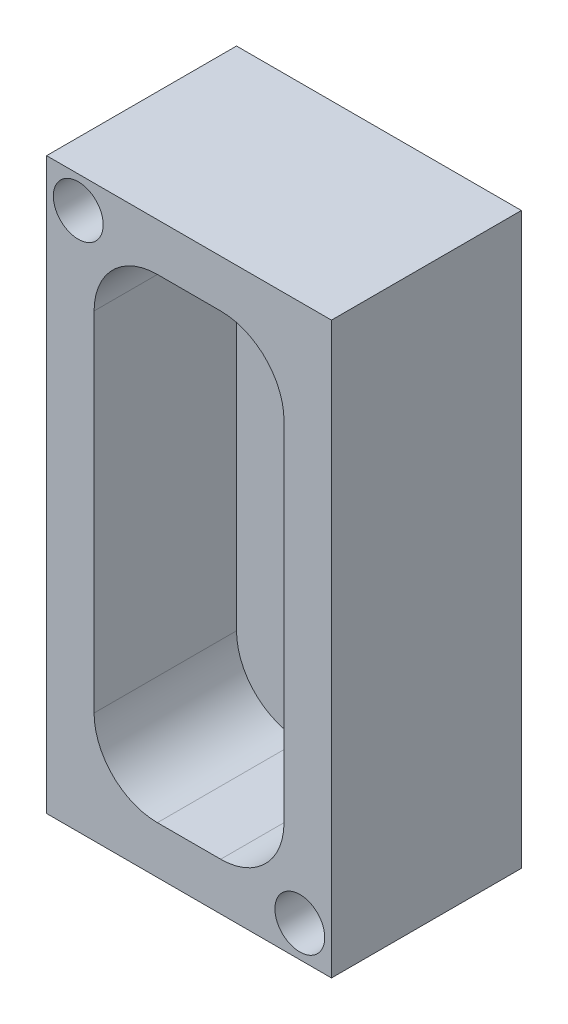
ISO-10303-21;
HEADER;
FILE_DESCRIPTION(('STEP AP214'),'2;1');
FILE_NAME('part.step','',(''),(''),'','','');
FILE_SCHEMA(('AUTOMOTIVE_DESIGN { 1 0 10303 214 1 1 1 1 }'));
ENDSEC;
DATA;
#1=APPLICATION_CONTEXT('core data for automotive mechanical design processes');
#2=APPLICATION_PROTOCOL_DEFINITION('international standard','automotive_design',2000,#1);
#3=PRODUCT_CONTEXT('',#1,'mechanical');
#4=PRODUCT('Part','Part','',(#3));
#5=PRODUCT_RELATED_PRODUCT_CATEGORY('part','',(#4));
#6=PRODUCT_DEFINITION_FORMATION('','',#4);
#7=PRODUCT_DEFINITION_CONTEXT('part definition',#1,'design');
#8=PRODUCT_DEFINITION('design','',#6,#7);
#9=PRODUCT_DEFINITION_SHAPE('','',#8);
#10=(LENGTH_UNIT() NAMED_UNIT(*) SI_UNIT(.MILLI.,.METRE.));
#11=(NAMED_UNIT(*) PLANE_ANGLE_UNIT() SI_UNIT($,.RADIAN.));
#12=(NAMED_UNIT(*) SI_UNIT($,.STERADIAN.) SOLID_ANGLE_UNIT());
#13=UNCERTAINTY_MEASURE_WITH_UNIT(LENGTH_MEASURE(1.E-05),#10,'distance_accuracy_value','');
#14=(GEOMETRIC_REPRESENTATION_CONTEXT(3) GLOBAL_UNCERTAINTY_ASSIGNED_CONTEXT((#13)) GLOBAL_UNIT_ASSIGNED_CONTEXT((#10,
#11,#12)) REPRESENTATION_CONTEXT('',''));
#15=CARTESIAN_POINT('',(0.,0.,0.));
#16=DIRECTION('',(0.,0.,1.));
#17=DIRECTION('',(1.,0.,0.));
#18=AXIS2_PLACEMENT_3D('',#15,#16,#17);
#19=CARTESIAN_POINT('',(0.,-12.,10.));
#20=DIRECTION('',(0.,0.,-1.));
#21=DIRECTION('',(-1.,0.,0.));
#22=AXIS2_PLACEMENT_3D('',#19,#20,#21);
#23=CYLINDRICAL_SURFACE('',#22,2.525);
#24=CARTESIAN_POINT('',(0.,-12.,0.));
#25=DIRECTION('',(0.,0.,1.));
#26=DIRECTION('',(1.,0.,0.));
#27=AXIS2_PLACEMENT_3D('',#24,#25,#26);
#28=CIRCLE('',#27,2.525);
#29=CARTESIAN_POINT('',(2.525,-12.,0.));
#30=VERTEX_POINT('',#29);
#31=EDGE_CURVE('E196',#30,#30,#28,.T.);
#32=ORIENTED_EDGE('',*,*,#31,.F.);
#33=EDGE_LOOP('',(#32));
#34=FACE_BOUND('',#33,.T.);
#35=CARTESIAN_POINT('',(0.,-12.,2.));
#36=DIRECTION('',(0.,0.,1.));
#37=DIRECTION('',(1.,0.,0.));
#38=AXIS2_PLACEMENT_3D('',#35,#36,#37);
#39=CIRCLE('',#38,2.525);
#40=CARTESIAN_POINT('',(2.525,-12.,2.));
#41=VERTEX_POINT('',#40);
#42=EDGE_CURVE('E200',#41,#41,#39,.T.);
#43=ORIENTED_EDGE('',*,*,#42,.T.);
#44=EDGE_LOOP('',(#43));
#45=FACE_BOUND('',#44,.T.);
#46=ADVANCED_FACE('F43',(#34,#45),#23,.F.);
#47=CARTESIAN_POINT('',(0.,0.,10.));
#48=DIRECTION('',(0.,0.,-1.));
#49=DIRECTION('',(-1.,0.,0.));
#50=AXIS2_PLACEMENT_3D('',#47,#48,#49);
#51=CYLINDRICAL_SURFACE('',#50,2.525);
#52=CARTESIAN_POINT('',(0.,0.,0.));
#53=DIRECTION('',(0.,0.,1.));
#54=DIRECTION('',(1.,0.,0.));
#55=AXIS2_PLACEMENT_3D('',#52,#53,#54);
#56=CIRCLE('',#55,2.525);
#57=CARTESIAN_POINT('',(2.525,0.,0.));
#58=VERTEX_POINT('',#57);
#59=EDGE_CURVE('E192',#58,#58,#56,.T.);
#60=ORIENTED_EDGE('',*,*,#59,.F.);
#61=EDGE_LOOP('',(#60));
#62=FACE_BOUND('',#61,.T.);
#63=CARTESIAN_POINT('',(0.,0.,2.));
#64=DIRECTION('',(0.,0.,1.));
#65=DIRECTION('',(1.,0.,0.));
#66=AXIS2_PLACEMENT_3D('',#63,#64,#65);
#67=CIRCLE('',#66,2.525);
#68=CARTESIAN_POINT('',(2.525,0.,2.));
#69=VERTEX_POINT('',#68);
#70=EDGE_CURVE('E279',#69,#69,#67,.T.);
#71=ORIENTED_EDGE('',*,*,#70,.T.);
#72=EDGE_LOOP('',(#71));
#73=FACE_BOUND('',#72,.T.);
#74=ADVANCED_FACE('F376',(#62,#73),#51,.F.);
#75=CARTESIAN_POINT('',(0.,12.,10.));
#76=DIRECTION('',(0.,0.,-1.));
#77=DIRECTION('',(-1.,0.,0.));
#78=AXIS2_PLACEMENT_3D('',#75,#76,#77);
#79=CYLINDRICAL_SURFACE('',#78,2.525);
#80=CARTESIAN_POINT('',(0.,12.,0.));
#81=DIRECTION('',(0.,0.,1.));
#82=DIRECTION('',(1.,0.,0.));
#83=AXIS2_PLACEMENT_3D('',#80,#81,#82);
#84=CIRCLE('',#83,2.525);
#85=CARTESIAN_POINT('',(2.525,12.,0.));
#86=VERTEX_POINT('',#85);
#87=EDGE_CURVE('E187',#86,#86,#84,.T.);
#88=ORIENTED_EDGE('',*,*,#87,.F.);
#89=EDGE_LOOP('',(#88));
#90=FACE_BOUND('',#89,.T.);
#91=CARTESIAN_POINT('',(0.,12.,2.));
#92=DIRECTION('',(0.,0.,1.));
#93=DIRECTION('',(1.,0.,0.));
#94=AXIS2_PLACEMENT_3D('',#91,#92,#93);
#95=CIRCLE('',#94,2.525);
#96=CARTESIAN_POINT('',(2.525,12.,2.));
#97=VERTEX_POINT('',#96);
#98=EDGE_CURVE('E167',#97,#97,#95,.T.);
#99=ORIENTED_EDGE('',*,*,#98,.T.);
#100=EDGE_LOOP('',(#99));
#101=FACE_BOUND('',#100,.T.);
#102=ADVANCED_FACE('F382',(#90,#101),#79,.F.);
#103=CARTESIAN_POINT('',(0.,-18.,12.));
#104=DIRECTION('',(0.,1.,0.));
#105=DIRECTION('',(0.,0.,1.));
#106=AXIS2_PLACEMENT_3D('',#103,#104,#105);
#107=PLANE('',#106);
#108=DIRECTION('',(1.,0.,0.));
#109=VECTOR('',#108,1.);
#110=CARTESIAN_POINT('',(0.,-18.,0.));
#111=LINE('',#110,#109);
#112=CARTESIAN_POINT('',(-9.,-18.,0.));
#113=VERTEX_POINT('',#112);
#114=CARTESIAN_POINT('',(9.,-18.,0.));
#115=VERTEX_POINT('',#114);
#116=EDGE_CURVE('E231',#113,#115,#111,.T.);
#117=ORIENTED_EDGE('',*,*,#116,.T.);
#118=DIRECTION('',(0.,0.,-1.));
#119=VECTOR('',#118,1.);
#120=CARTESIAN_POINT('',(9.,-18.,12.));
#121=LINE('',#120,#119);
#122=CARTESIAN_POINT('',(9.,-18.,12.));
#123=VERTEX_POINT('',#122);
#124=EDGE_CURVE('E271',#123,#115,#121,.T.);
#125=ORIENTED_EDGE('',*,*,#124,.F.);
#126=DIRECTION('',(1.,0.,0.));
#127=VECTOR('',#126,1.);
#128=CARTESIAN_POINT('',(0.,-18.,12.));
#129=LINE('',#128,#127);
#130=CARTESIAN_POINT('',(-9.,-18.,12.));
#131=VERTEX_POINT('',#130);
#132=EDGE_CURVE('E232',#131,#123,#129,.T.);
#133=ORIENTED_EDGE('',*,*,#132,.F.);
#134=DIRECTION('',(0.,0.,-1.));
#135=VECTOR('',#134,1.);
#136=CARTESIAN_POINT('',(-9.,-18.,12.));
#137=LINE('',#136,#135);
#138=EDGE_CURVE('E248',#131,#113,#137,.T.);
#139=ORIENTED_EDGE('',*,*,#138,.T.);
#140=EDGE_LOOP('',(#117,#125,#133,#139));
#141=FACE_BOUND('',#140,.T.);
#142=ADVANCED_FACE('F418',(#141),#107,.F.);
#143=CARTESIAN_POINT('',(9.,0.,12.));
#144=DIRECTION('',(-1.,0.,0.));
#145=DIRECTION('',(0.,0.,1.));
#146=AXIS2_PLACEMENT_3D('',#143,#144,#145);
#147=PLANE('',#146);
#148=DIRECTION('',(0.,1.,0.));
#149=VECTOR('',#148,1.);
#150=CARTESIAN_POINT('',(9.,0.,0.));
#151=LINE('',#150,#149);
#152=CARTESIAN_POINT('',(9.,18.,0.));
#153=VERTEX_POINT('',#152);
#154=EDGE_CURVE('E252',#115,#153,#151,.T.);
#155=ORIENTED_EDGE('',*,*,#154,.T.);
#156=DIRECTION('',(0.,0.,-1.));
#157=VECTOR('',#156,1.);
#158=CARTESIAN_POINT('',(9.,18.,12.));
#159=LINE('',#158,#157);
#160=CARTESIAN_POINT('',(9.,18.,12.));
#161=VERTEX_POINT('',#160);
#162=EDGE_CURVE('E268',#161,#153,#159,.T.);
#163=ORIENTED_EDGE('',*,*,#162,.F.);
#164=DIRECTION('',(0.,1.,0.));
#165=VECTOR('',#164,1.);
#166=CARTESIAN_POINT('',(9.,0.,12.));
#167=LINE('',#166,#165);
#168=EDGE_CURVE('E236',#123,#161,#167,.T.);
#169=ORIENTED_EDGE('',*,*,#168,.F.);
#170=ORIENTED_EDGE('',*,*,#124,.T.);
#171=EDGE_LOOP('',(#155,#163,#169,#170));
#172=FACE_BOUND('',#171,.T.);
#173=ADVANCED_FACE('F415',(#172),#147,.F.);
#174=CARTESIAN_POINT('',(0.,18.,12.));
#175=DIRECTION('',(0.,1.,0.));
#176=DIRECTION('',(0.,0.,1.));
#177=AXIS2_PLACEMENT_3D('',#174,#175,#176);
#178=PLANE('',#177);
#179=DIRECTION('',(1.,0.,0.));
#180=VECTOR('',#179,1.);
#181=CARTESIAN_POINT('',(0.,18.,0.));
#182=LINE('',#181,#180);
#183=CARTESIAN_POINT('',(-9.,18.,0.));
#184=VERTEX_POINT('',#183);
#185=EDGE_CURVE('E256',#184,#153,#182,.T.);
#186=ORIENTED_EDGE('',*,*,#185,.F.);
#187=DIRECTION('',(0.,0.,-1.));
#188=VECTOR('',#187,1.);
#189=CARTESIAN_POINT('',(-9.,18.,12.));
#190=LINE('',#189,#188);
#191=CARTESIAN_POINT('',(-9.,18.,12.));
#192=VERTEX_POINT('',#191);
#193=EDGE_CURVE('E265',#192,#184,#190,.T.);
#194=ORIENTED_EDGE('',*,*,#193,.F.);
#195=DIRECTION('',(1.,0.,0.));
#196=VECTOR('',#195,1.);
#197=CARTESIAN_POINT('',(0.,18.,12.));
#198=LINE('',#197,#196);
#199=EDGE_CURVE('E240',#192,#161,#198,.T.);
#200=ORIENTED_EDGE('',*,*,#199,.T.);
#201=ORIENTED_EDGE('',*,*,#162,.T.);
#202=EDGE_LOOP('',(#186,#194,#200,#201));
#203=FACE_BOUND('',#202,.T.);
#204=ADVANCED_FACE('F411',(#203),#178,.T.);
#205=CARTESIAN_POINT('',(-9.,0.,12.));
#206=DIRECTION('',(-1.,0.,0.));
#207=DIRECTION('',(0.,0.,1.));
#208=AXIS2_PLACEMENT_3D('',#205,#206,#207);
#209=PLANE('',#208);
#210=DIRECTION('',(0.,1.,0.));
#211=VECTOR('',#210,1.);
#212=CARTESIAN_POINT('',(-9.,0.,0.));
#213=LINE('',#212,#211);
#214=EDGE_CURVE('E237',#113,#184,#213,.T.);
#215=ORIENTED_EDGE('',*,*,#214,.F.);
#216=ORIENTED_EDGE('',*,*,#138,.F.);
#217=DIRECTION('',(0.,1.,0.));
#218=VECTOR('',#217,1.);
#219=CARTESIAN_POINT('',(-9.,0.,12.));
#220=LINE('',#219,#218);
#221=EDGE_CURVE('E244',#131,#192,#220,.T.);
#222=ORIENTED_EDGE('',*,*,#221,.T.);
#223=ORIENTED_EDGE('',*,*,#193,.T.);
#224=EDGE_LOOP('',(#215,#216,#222,#223));
#225=FACE_BOUND('',#224,.T.);
#226=ADVANCED_FACE('F404',(#225),#209,.T.);
#227=CARTESIAN_POINT('',(0.,0.,12.));
#228=DIRECTION('',(0.,0.,1.));
#229=DIRECTION('',(1.,0.,0.));
#230=AXIS2_PLACEMENT_3D('',#227,#228,#229);
#231=PLANE('',#230);
#232=CARTESIAN_POINT('',(7.,-16.,12.));
#233=DIRECTION('',(0.,0.,1.));
#234=DIRECTION('',(1.,0.,0.));
#235=AXIS2_PLACEMENT_3D('',#232,#233,#234);
#236=CIRCLE('',#235,1.57499999999999);
#237=CARTESIAN_POINT('',(8.57499999999999,-16.,12.));
#238=VERTEX_POINT('',#237);
#239=EDGE_CURVE('E149',#238,#238,#236,.T.);
#240=ORIENTED_EDGE('',*,*,#239,.F.);
#241=EDGE_LOOP('',(#240));
#242=FACE_BOUND('',#241,.T.);
#243=CARTESIAN_POINT('',(-7.,16.,12.));
#244=DIRECTION('',(0.,0.,1.));
#245=DIRECTION('',(1.,0.,0.));
#246=AXIS2_PLACEMENT_3D('',#243,#244,#245);
#247=CIRCLE('',#246,1.57499999999999);
#248=CARTESIAN_POINT('',(-5.42500000000001,16.,12.));
#249=VERTEX_POINT('',#248);
#250=EDGE_CURVE('E148',#249,#249,#247,.T.);
#251=ORIENTED_EDGE('',*,*,#250,.F.);
#252=EDGE_LOOP('',(#251));
#253=FACE_BOUND('',#252,.T.);
#254=DIRECTION('',(1.,0.,0.));
#255=VECTOR('',#254,1.);
#256=CARTESIAN_POINT('',(0.,-15.,12.));
#257=LINE('',#256,#255);
#258=CARTESIAN_POINT('',(-2.,-15.,12.));
#259=VERTEX_POINT('',#258);
#260=CARTESIAN_POINT('',(2.,-15.,12.));
#261=VERTEX_POINT('',#260);
#262=EDGE_CURVE('E216',#259,#261,#257,.T.);
#263=ORIENTED_EDGE('',*,*,#262,.F.);
#264=CARTESIAN_POINT('',(-2.,-11.,12.));
#265=DIRECTION('',(0.,0.,1.));
#266=DIRECTION('',(1.,0.,0.));
#267=AXIS2_PLACEMENT_3D('',#264,#265,#266);
#268=CIRCLE('',#267,4.);
#269=CARTESIAN_POINT('',(-6.,-11.,12.));
#270=VERTEX_POINT('',#269);
#271=EDGE_CURVE('E52',#259,#270,#268,.F.);
#272=ORIENTED_EDGE('',*,*,#271,.T.);
#273=DIRECTION('',(0.,1.,0.));
#274=VECTOR('',#273,1.);
#275=CARTESIAN_POINT('',(-6.,0.,12.));
#276=LINE('',#275,#274);
#277=CARTESIAN_POINT('',(-6.,11.,12.));
#278=VERTEX_POINT('',#277);
#279=EDGE_CURVE('E227',#270,#278,#276,.T.);
#280=ORIENTED_EDGE('',*,*,#279,.T.);
#281=CARTESIAN_POINT('',(-2.,11.,12.));
#282=DIRECTION('',(0.,0.,1.));
#283=DIRECTION('',(1.,0.,0.));
#284=AXIS2_PLACEMENT_3D('',#281,#282,#283);
#285=CIRCLE('',#284,4.);
#286=CARTESIAN_POINT('',(-2.,15.,12.));
#287=VERTEX_POINT('',#286);
#288=EDGE_CURVE('E324',#278,#287,#285,.F.);
#289=ORIENTED_EDGE('',*,*,#288,.T.);
#290=DIRECTION('',(1.,0.,0.));
#291=VECTOR('',#290,1.);
#292=CARTESIAN_POINT('',(0.,15.,12.));
#293=LINE('',#292,#291);
#294=CARTESIAN_POINT('',(2.,15.,12.));
#295=VERTEX_POINT('',#294);
#296=EDGE_CURVE('E223',#287,#295,#293,.T.);
#297=ORIENTED_EDGE('',*,*,#296,.T.);
#298=CARTESIAN_POINT('',(2.,11.,12.));
#299=DIRECTION('',(0.,0.,1.));
#300=DIRECTION('',(1.,0.,0.));
#301=AXIS2_PLACEMENT_3D('',#298,#299,#300);
#302=CIRCLE('',#301,4.);
#303=CARTESIAN_POINT('',(6.,11.,12.));
#304=VERTEX_POINT('',#303);
#305=EDGE_CURVE('E327',#295,#304,#302,.F.);
#306=ORIENTED_EDGE('',*,*,#305,.T.);
#307=DIRECTION('',(0.,1.,0.));
#308=VECTOR('',#307,1.);
#309=CARTESIAN_POINT('',(6.,0.,12.));
#310=LINE('',#309,#308);
#311=CARTESIAN_POINT('',(6.,-11.,12.));
#312=VERTEX_POINT('',#311);
#313=EDGE_CURVE('E219',#312,#304,#310,.T.);
#314=ORIENTED_EDGE('',*,*,#313,.F.);
#315=CARTESIAN_POINT('',(2.,-11.,12.));
#316=DIRECTION('',(0.,0.,1.));
#317=DIRECTION('',(1.,0.,0.));
#318=AXIS2_PLACEMENT_3D('',#315,#316,#317);
#319=CIRCLE('',#318,4.);
#320=EDGE_CURVE('E11',#312,#261,#319,.F.);
#321=ORIENTED_EDGE('',*,*,#320,.T.);
#322=EDGE_LOOP('',(#263,#272,#280,#289,#297,#306,#314,#321));
#323=FACE_BOUND('',#322,.T.);
#324=ORIENTED_EDGE('',*,*,#132,.T.);
#325=ORIENTED_EDGE('',*,*,#168,.T.);
#326=ORIENTED_EDGE('',*,*,#199,.F.);
#327=ORIENTED_EDGE('',*,*,#221,.F.);
#328=EDGE_LOOP('',(#324,#325,#326,#327));
#329=FACE_BOUND('',#328,.T.);
#330=ADVANCED_FACE('F332',(#242,#253,#323,#329),#231,.T.);
#331=CARTESIAN_POINT('',(0.,0.,0.));
#332=DIRECTION('',(0.,0.,1.));
#333=DIRECTION('',(1.,0.,0.));
#334=AXIS2_PLACEMENT_3D('',#331,#332,#333);
#335=PLANE('',#334);
#336=ORIENTED_EDGE('',*,*,#87,.T.);
#337=EDGE_LOOP('',(#336));
#338=FACE_BOUND('',#337,.T.);
#339=ORIENTED_EDGE('',*,*,#59,.T.);
#340=EDGE_LOOP('',(#339));
#341=FACE_BOUND('',#340,.T.);
#342=ORIENTED_EDGE('',*,*,#31,.T.);
#343=EDGE_LOOP('',(#342));
#344=FACE_BOUND('',#343,.T.);
#345=ORIENTED_EDGE('',*,*,#116,.F.);
#346=ORIENTED_EDGE('',*,*,#214,.T.);
#347=ORIENTED_EDGE('',*,*,#185,.T.);
#348=ORIENTED_EDGE('',*,*,#154,.F.);
#349=EDGE_LOOP('',(#345,#346,#347,#348));
#350=FACE_BOUND('',#349,.T.);
#351=ADVANCED_FACE('F391',(#338,#341,#344,#350),#335,.F.);
#352=CARTESIAN_POINT('',(0.,-15.,12.));
#353=DIRECTION('',(0.,1.,0.));
#354=DIRECTION('',(0.,0.,1.));
#355=AXIS2_PLACEMENT_3D('',#352,#353,#354);
#356=PLANE('',#355);
#357=DIRECTION('',(1.,0.,0.));
#358=VECTOR('',#357,1.);
#359=CARTESIAN_POINT('',(0.,-15.,3.));
#360=LINE('',#359,#358);
#361=CARTESIAN_POINT('',(-2.,-15.,3.));
#362=VERTEX_POINT('',#361);
#363=CARTESIAN_POINT('',(2.,-15.,3.));
#364=VERTEX_POINT('',#363);
#365=EDGE_CURVE('E191',#362,#364,#360,.T.);
#366=ORIENTED_EDGE('',*,*,#365,.F.);
#367=DIRECTION('',(0.,0.,-1.));
#368=VECTOR('',#367,1.);
#369=CARTESIAN_POINT('',(-2.,-15.,12.));
#370=LINE('',#369,#368);
#371=EDGE_CURVE('E64',#362,#259,#370,.F.);
#372=ORIENTED_EDGE('',*,*,#371,.T.);
#373=ORIENTED_EDGE('',*,*,#262,.T.);
#374=DIRECTION('',(0.,0.,-1.));
#375=VECTOR('',#374,1.);
#376=CARTESIAN_POINT('',(2.,-15.,3.));
#377=LINE('',#376,#375);
#378=EDGE_CURVE('E318',#261,#364,#377,.T.);
#379=ORIENTED_EDGE('',*,*,#378,.T.);
#380=EDGE_LOOP('',(#366,#372,#373,#379));
#381=FACE_BOUND('',#380,.T.);
#382=ADVANCED_FACE('F345',(#381),#356,.T.);
#383=CARTESIAN_POINT('',(6.,0.,12.));
#384=DIRECTION('',(-1.,0.,0.));
#385=DIRECTION('',(0.,0.,1.));
#386=AXIS2_PLACEMENT_3D('',#383,#384,#385);
#387=PLANE('',#386);
#388=ORIENTED_EDGE('',*,*,#313,.T.);
#389=DIRECTION('',(0.,0.,-1.));
#390=VECTOR('',#389,1.);
#391=CARTESIAN_POINT('',(6.,11.,12.));
#392=LINE('',#391,#390);
#393=CARTESIAN_POINT('',(6.,11.,3.));
#394=VERTEX_POINT('',#393);
#395=EDGE_CURVE('E314',#304,#394,#392,.T.);
#396=ORIENTED_EDGE('',*,*,#395,.T.);
#397=DIRECTION('',(0.,1.,0.));
#398=VECTOR('',#397,1.);
#399=CARTESIAN_POINT('',(6.,0.,3.));
#400=LINE('',#399,#398);
#401=CARTESIAN_POINT('',(6.,-11.,3.));
#402=VERTEX_POINT('',#401);
#403=EDGE_CURVE('E204',#402,#394,#400,.T.);
#404=ORIENTED_EDGE('',*,*,#403,.F.);
#405=DIRECTION('',(0.,0.,-1.));
#406=VECTOR('',#405,1.);
#407=CARTESIAN_POINT('',(6.,-11.,12.));
#408=LINE('',#407,#406);
#409=EDGE_CURVE('E311',#402,#312,#408,.F.);
#410=ORIENTED_EDGE('',*,*,#409,.T.);
#411=EDGE_LOOP('',(#388,#396,#404,#410));
#412=FACE_BOUND('',#411,.T.);
#413=ADVANCED_FACE('F351',(#412),#387,.T.);
#414=CARTESIAN_POINT('',(0.,15.,12.));
#415=DIRECTION('',(0.,1.,0.));
#416=DIRECTION('',(0.,0.,1.));
#417=AXIS2_PLACEMENT_3D('',#414,#415,#416);
#418=PLANE('',#417);
#419=ORIENTED_EDGE('',*,*,#296,.F.);
#420=DIRECTION('',(0.,0.,-1.));
#421=VECTOR('',#420,1.);
#422=CARTESIAN_POINT('',(-2.,15.,3.));
#423=LINE('',#422,#421);
#424=CARTESIAN_POINT('',(-2.,15.,3.));
#425=VERTEX_POINT('',#424);
#426=EDGE_CURVE('E288',#287,#425,#423,.T.);
#427=ORIENTED_EDGE('',*,*,#426,.T.);
#428=DIRECTION('',(1.,0.,0.));
#429=VECTOR('',#428,1.);
#430=CARTESIAN_POINT('',(0.,15.,3.));
#431=LINE('',#430,#429);
#432=CARTESIAN_POINT('',(2.,15.,3.));
#433=VERTEX_POINT('',#432);
#434=EDGE_CURVE('E208',#425,#433,#431,.T.);
#435=ORIENTED_EDGE('',*,*,#434,.T.);
#436=DIRECTION('',(0.,0.,-1.));
#437=VECTOR('',#436,1.);
#438=CARTESIAN_POINT('',(2.,15.,12.));
#439=LINE('',#438,#437);
#440=EDGE_CURVE('E275',#433,#295,#439,.F.);
#441=ORIENTED_EDGE('',*,*,#440,.T.);
#442=EDGE_LOOP('',(#419,#427,#435,#441));
#443=FACE_BOUND('',#442,.T.);
#444=ADVANCED_FACE('F359',(#443),#418,.F.);
#445=CARTESIAN_POINT('',(-6.,0.,12.));
#446=DIRECTION('',(-1.,0.,0.));
#447=DIRECTION('',(0.,0.,1.));
#448=AXIS2_PLACEMENT_3D('',#445,#446,#447);
#449=PLANE('',#448);
#450=DIRECTION('',(0.,1.,0.));
#451=VECTOR('',#450,1.);
#452=CARTESIAN_POINT('',(-6.,0.,3.));
#453=LINE('',#452,#451);
#454=CARTESIAN_POINT('',(-6.,-11.,3.));
#455=VERTEX_POINT('',#454);
#456=CARTESIAN_POINT('',(-6.,11.,3.));
#457=VERTEX_POINT('',#456);
#458=EDGE_CURVE('E212',#455,#457,#453,.T.);
#459=ORIENTED_EDGE('',*,*,#458,.T.);
#460=DIRECTION('',(0.,0.,-1.));
#461=VECTOR('',#460,1.);
#462=CARTESIAN_POINT('',(-6.,11.,12.));
#463=LINE('',#462,#461);
#464=EDGE_CURVE('E308',#457,#278,#463,.F.);
#465=ORIENTED_EDGE('',*,*,#464,.T.);
#466=ORIENTED_EDGE('',*,*,#279,.F.);
#467=DIRECTION('',(0.,0.,-1.));
#468=VECTOR('',#467,1.);
#469=CARTESIAN_POINT('',(-6.,-11.,12.));
#470=LINE('',#469,#468);
#471=EDGE_CURVE('E304',#270,#455,#470,.T.);
#472=ORIENTED_EDGE('',*,*,#471,.T.);
#473=EDGE_LOOP('',(#459,#465,#466,#472));
#474=FACE_BOUND('',#473,.T.);
#475=ADVANCED_FACE('F338',(#474),#449,.F.);
#476=CARTESIAN_POINT('',(0.,0.,3.));
#477=DIRECTION('',(0.,0.,1.));
#478=DIRECTION('',(1.,0.,0.));
#479=AXIS2_PLACEMENT_3D('',#476,#477,#478);
#480=PLANE('',#479);
#481=CARTESIAN_POINT('',(0.,12.,3.));
#482=DIRECTION('',(0.,0.,1.));
#483=DIRECTION('',(1.,0.,0.));
#484=AXIS2_PLACEMENT_3D('',#481,#482,#483);
#485=CIRCLE('',#484,2.925);
#486=CARTESIAN_POINT('',(2.925,12.,3.));
#487=VERTEX_POINT('',#486);
#488=EDGE_CURVE('E168',#487,#487,#485,.T.);
#489=ORIENTED_EDGE('',*,*,#488,.F.);
#490=EDGE_LOOP('',(#489));
#491=FACE_BOUND('',#490,.T.);
#492=CARTESIAN_POINT('',(0.,0.,3.));
#493=DIRECTION('',(0.,0.,1.));
#494=DIRECTION('',(1.,0.,0.));
#495=AXIS2_PLACEMENT_3D('',#492,#493,#494);
#496=CIRCLE('',#495,2.925);
#497=CARTESIAN_POINT('',(2.925,0.,3.));
#498=VERTEX_POINT('',#497);
#499=EDGE_CURVE('E176',#498,#498,#496,.T.);
#500=ORIENTED_EDGE('',*,*,#499,.F.);
#501=EDGE_LOOP('',(#500));
#502=FACE_BOUND('',#501,.T.);
#503=CARTESIAN_POINT('',(0.,-12.,3.));
#504=DIRECTION('',(0.,0.,1.));
#505=DIRECTION('',(1.,0.,0.));
#506=AXIS2_PLACEMENT_3D('',#503,#504,#505);
#507=CIRCLE('',#506,2.925);
#508=CARTESIAN_POINT('',(2.925,-12.,3.));
#509=VERTEX_POINT('',#508);
#510=EDGE_CURVE('E162',#509,#509,#507,.T.);
#511=ORIENTED_EDGE('',*,*,#510,.F.);
#512=EDGE_LOOP('',(#511));
#513=FACE_BOUND('',#512,.T.);
#514=ORIENTED_EDGE('',*,*,#434,.F.);
#515=CARTESIAN_POINT('',(-2.,11.,3.));
#516=DIRECTION('',(0.,0.,1.));
#517=DIRECTION('',(1.,0.,0.));
#518=AXIS2_PLACEMENT_3D('',#515,#516,#517);
#519=CIRCLE('',#518,4.);
#520=EDGE_CURVE('E301',#425,#457,#519,.T.);
#521=ORIENTED_EDGE('',*,*,#520,.T.);
#522=ORIENTED_EDGE('',*,*,#458,.F.);
#523=CARTESIAN_POINT('',(-2.,-11.,3.));
#524=DIRECTION('',(0.,0.,1.));
#525=DIRECTION('',(1.,0.,0.));
#526=AXIS2_PLACEMENT_3D('',#523,#524,#525);
#527=CIRCLE('',#526,4.);
#528=EDGE_CURVE('E295',#455,#362,#527,.T.);
#529=ORIENTED_EDGE('',*,*,#528,.T.);
#530=ORIENTED_EDGE('',*,*,#365,.T.);
#531=CARTESIAN_POINT('',(2.,-11.,3.));
#532=DIRECTION('',(0.,0.,1.));
#533=DIRECTION('',(1.,0.,0.));
#534=AXIS2_PLACEMENT_3D('',#531,#532,#533);
#535=CIRCLE('',#534,4.);
#536=EDGE_CURVE('E292',#364,#402,#535,.T.);
#537=ORIENTED_EDGE('',*,*,#536,.T.);
#538=ORIENTED_EDGE('',*,*,#403,.T.);
#539=CARTESIAN_POINT('',(2.,11.,3.));
#540=DIRECTION('',(0.,0.,1.));
#541=DIRECTION('',(1.,0.,0.));
#542=AXIS2_PLACEMENT_3D('',#539,#540,#541);
#543=CIRCLE('',#542,4.);
#544=EDGE_CURVE('E298',#394,#433,#543,.T.);
#545=ORIENTED_EDGE('',*,*,#544,.T.);
#546=EDGE_LOOP('',(#514,#521,#522,#529,#530,#537,#538,#545));
#547=FACE_BOUND('',#546,.T.);
#548=ADVANCED_FACE('F344',(#491,#502,#513,#547),#480,.T.);
#549=CARTESIAN_POINT('',(0.,12.,2.));
#550=DIRECTION('',(0.,0.,1.));
#551=DIRECTION('',(1.,0.,0.));
#552=AXIS2_PLACEMENT_3D('',#549,#550,#551);
#553=CYLINDRICAL_SURFACE('',#552,2.925);
#554=CARTESIAN_POINT('',(0.,12.,2.));
#555=DIRECTION('',(0.,0.,1.));
#556=DIRECTION('',(1.,0.,0.));
#557=AXIS2_PLACEMENT_3D('',#554,#555,#556);
#558=CIRCLE('',#557,2.925);
#559=CARTESIAN_POINT('',(2.925,12.,2.));
#560=VERTEX_POINT('',#559);
#561=EDGE_CURVE('E163',#560,#560,#558,.T.);
#562=ORIENTED_EDGE('',*,*,#561,.F.);
#563=EDGE_LOOP('',(#562));
#564=FACE_BOUND('',#563,.T.);
#565=ORIENTED_EDGE('',*,*,#488,.T.);
#566=EDGE_LOOP('',(#565));
#567=FACE_BOUND('',#566,.T.);
#568=ADVANCED_FACE('F400',(#564,#567),#553,.F.);
#569=CARTESIAN_POINT('',(0.,12.,2.));
#570=DIRECTION('',(0.,0.,1.));
#571=DIRECTION('',(1.,0.,0.));
#572=AXIS2_PLACEMENT_3D('',#569,#570,#571);
#573=PLANE('',#572);
#574=ORIENTED_EDGE('',*,*,#98,.F.);
#575=EDGE_LOOP('',(#574));
#576=FACE_BOUND('',#575,.T.);
#577=ORIENTED_EDGE('',*,*,#561,.T.);
#578=EDGE_LOOP('',(#577));
#579=FACE_BOUND('',#578,.T.);
#580=ADVANCED_FACE('F447',(#576,#579),#573,.T.);
#581=CARTESIAN_POINT('',(0.,0.,2.));
#582=DIRECTION('',(0.,0.,1.));
#583=DIRECTION('',(1.,0.,0.));
#584=AXIS2_PLACEMENT_3D('',#581,#582,#583);
#585=CYLINDRICAL_SURFACE('',#584,2.925);
#586=CARTESIAN_POINT('',(0.,0.,2.));
#587=DIRECTION('',(0.,0.,1.));
#588=DIRECTION('',(1.,0.,0.));
#589=AXIS2_PLACEMENT_3D('',#586,#587,#588);
#590=CIRCLE('',#589,2.925);
#591=CARTESIAN_POINT('',(2.925,0.,2.));
#592=VERTEX_POINT('',#591);
#593=EDGE_CURVE('E172',#592,#592,#590,.T.);
#594=ORIENTED_EDGE('',*,*,#593,.F.);
#595=EDGE_LOOP('',(#594));
#596=FACE_BOUND('',#595,.T.);
#597=ORIENTED_EDGE('',*,*,#499,.T.);
#598=EDGE_LOOP('',(#597));
#599=FACE_BOUND('',#598,.T.);
#600=ADVANCED_FACE('F444',(#596,#599),#585,.F.);
#601=CARTESIAN_POINT('',(0.,0.,2.));
#602=DIRECTION('',(0.,0.,1.));
#603=DIRECTION('',(1.,0.,0.));
#604=AXIS2_PLACEMENT_3D('',#601,#602,#603);
#605=PLANE('',#604);
#606=ORIENTED_EDGE('',*,*,#70,.F.);
#607=EDGE_LOOP('',(#606));
#608=FACE_BOUND('',#607,.T.);
#609=ORIENTED_EDGE('',*,*,#593,.T.);
#610=EDGE_LOOP('',(#609));
#611=FACE_BOUND('',#610,.T.);
#612=ADVANCED_FACE('F441',(#608,#611),#605,.T.);
#613=CARTESIAN_POINT('',(0.,-12.,2.));
#614=DIRECTION('',(0.,0.,1.));
#615=DIRECTION('',(1.,0.,0.));
#616=AXIS2_PLACEMENT_3D('',#613,#614,#615);
#617=CYLINDRICAL_SURFACE('',#616,2.925);
#618=CARTESIAN_POINT('',(0.,-12.,2.));
#619=DIRECTION('',(0.,0.,1.));
#620=DIRECTION('',(1.,0.,0.));
#621=AXIS2_PLACEMENT_3D('',#618,#619,#620);
#622=CIRCLE('',#621,2.925);
#623=CARTESIAN_POINT('',(2.925,-12.,2.));
#624=VERTEX_POINT('',#623);
#625=EDGE_CURVE('E180',#624,#624,#622,.T.);
#626=ORIENTED_EDGE('',*,*,#625,.F.);
#627=EDGE_LOOP('',(#626));
#628=FACE_BOUND('',#627,.T.);
#629=ORIENTED_EDGE('',*,*,#510,.T.);
#630=EDGE_LOOP('',(#629));
#631=FACE_BOUND('',#630,.T.);
#632=ADVANCED_FACE('F371',(#628,#631),#617,.F.);
#633=CARTESIAN_POINT('',(0.,-12.,2.));
#634=DIRECTION('',(0.,0.,1.));
#635=DIRECTION('',(1.,0.,0.));
#636=AXIS2_PLACEMENT_3D('',#633,#634,#635);
#637=PLANE('',#636);
#638=ORIENTED_EDGE('',*,*,#42,.F.);
#639=EDGE_LOOP('',(#638));
#640=FACE_BOUND('',#639,.T.);
#641=ORIENTED_EDGE('',*,*,#625,.T.);
#642=EDGE_LOOP('',(#641));
#643=FACE_BOUND('',#642,.T.);
#644=ADVANCED_FACE('F364',(#640,#643),#637,.T.);
#645=CARTESIAN_POINT('',(-2.,11.,12.));
#646=DIRECTION('',(0.,0.,1.));
#647=DIRECTION('',(1.,0.,0.));
#648=AXIS2_PLACEMENT_3D('',#645,#646,#647);
#649=CYLINDRICAL_SURFACE('',#648,4.);
#650=ORIENTED_EDGE('',*,*,#288,.F.);
#651=ORIENTED_EDGE('',*,*,#464,.F.);
#652=ORIENTED_EDGE('',*,*,#520,.F.);
#653=ORIENTED_EDGE('',*,*,#426,.F.);
#654=EDGE_LOOP('',(#650,#651,#652,#653));
#655=FACE_BOUND('',#654,.T.);
#656=ADVANCED_FACE('F362',(#655),#649,.F.);
#657=CARTESIAN_POINT('',(2.,11.,12.));
#658=DIRECTION('',(0.,0.,-1.));
#659=DIRECTION('',(-1.,0.,0.));
#660=AXIS2_PLACEMENT_3D('',#657,#658,#659);
#661=CYLINDRICAL_SURFACE('',#660,4.);
#662=ORIENTED_EDGE('',*,*,#305,.F.);
#663=ORIENTED_EDGE('',*,*,#440,.F.);
#664=ORIENTED_EDGE('',*,*,#544,.F.);
#665=ORIENTED_EDGE('',*,*,#395,.F.);
#666=EDGE_LOOP('',(#662,#663,#664,#665));
#667=FACE_BOUND('',#666,.T.);
#668=ADVANCED_FACE('F355',(#667),#661,.F.);
#669=CARTESIAN_POINT('',(-2.,-11.,12.));
#670=DIRECTION('',(0.,0.,-1.));
#671=DIRECTION('',(-1.,0.,0.));
#672=AXIS2_PLACEMENT_3D('',#669,#670,#671);
#673=CYLINDRICAL_SURFACE('',#672,4.);
#674=ORIENTED_EDGE('',*,*,#271,.F.);
#675=ORIENTED_EDGE('',*,*,#371,.F.);
#676=ORIENTED_EDGE('',*,*,#528,.F.);
#677=ORIENTED_EDGE('',*,*,#471,.F.);
#678=EDGE_LOOP('',(#674,#675,#676,#677));
#679=FACE_BOUND('',#678,.T.);
#680=ADVANCED_FACE('F341',(#679),#673,.F.);
#681=CARTESIAN_POINT('',(2.,-11.,12.));
#682=DIRECTION('',(0.,0.,1.));
#683=DIRECTION('',(1.,0.,0.));
#684=AXIS2_PLACEMENT_3D('',#681,#682,#683);
#685=CYLINDRICAL_SURFACE('',#684,4.);
#686=ORIENTED_EDGE('',*,*,#320,.F.);
#687=ORIENTED_EDGE('',*,*,#409,.F.);
#688=ORIENTED_EDGE('',*,*,#536,.F.);
#689=ORIENTED_EDGE('',*,*,#378,.F.);
#690=EDGE_LOOP('',(#686,#687,#688,#689));
#691=FACE_BOUND('',#690,.T.);
#692=ADVANCED_FACE('F45',(#691),#685,.F.);
#693=CARTESIAN_POINT('',(-7.,16.,8.7));
#694=DIRECTION('',(0.,0.,1.));
#695=DIRECTION('',(1.,0.,0.));
#696=AXIS2_PLACEMENT_3D('',#693,#694,#695);
#697=CONICAL_SURFACE('',#696,1.575,1.02974425867665);
#698=CARTESIAN_POINT('',(-7.,16.,7.75364452503159));
#699=VERTEX_POINT('',#698);
#700=VERTEX_LOOP('',#699);
#701=FACE_BOUND('',#700,.T.);
#702=CARTESIAN_POINT('',(-7.,16.,8.7));
#703=DIRECTION('',(0.,0.,1.));
#704=DIRECTION('',(1.,0.,0.));
#705=AXIS2_PLACEMENT_3D('',#702,#703,#704);
#706=CIRCLE('',#705,1.575);
#707=CARTESIAN_POINT('',(-5.425,16.,8.7));
#708=VERTEX_POINT('',#707);
#709=EDGE_CURVE('E154',#708,#708,#706,.T.);
#710=ORIENTED_EDGE('',*,*,#709,.T.);
#711=EDGE_LOOP('',(#710));
#712=FACE_BOUND('',#711,.T.);
#713=ADVANCED_FACE('F458',(#701,#712),#697,.F.);
#714=CARTESIAN_POINT('',(-7.,16.,12.));
#715=DIRECTION('',(0.,0.,1.));
#716=DIRECTION('',(1.,0.,0.));
#717=AXIS2_PLACEMENT_3D('',#714,#715,#716);
#718=CYLINDRICAL_SURFACE('',#717,1.57499999999999);
#719=ORIENTED_EDGE('',*,*,#709,.F.);
#720=EDGE_LOOP('',(#719));
#721=FACE_BOUND('',#720,.T.);
#722=ORIENTED_EDGE('',*,*,#250,.T.);
#723=EDGE_LOOP('',(#722));
#724=FACE_BOUND('',#723,.T.);
#725=ADVANCED_FACE('F141',(#721,#724),#718,.F.);
#726=CARTESIAN_POINT('',(7.,-16.,8.7));
#727=DIRECTION('',(0.,0.,1.));
#728=DIRECTION('',(1.,0.,0.));
#729=AXIS2_PLACEMENT_3D('',#726,#727,#728);
#730=CONICAL_SURFACE('',#729,1.575,1.02974425867665);
#731=CARTESIAN_POINT('',(7.,-16.,7.75364452503159));
#732=VERTEX_POINT('',#731);
#733=VERTEX_LOOP('',#732);
#734=FACE_BOUND('',#733,.T.);
#735=CARTESIAN_POINT('',(7.,-16.,8.7));
#736=DIRECTION('',(0.,0.,1.));
#737=DIRECTION('',(1.,0.,0.));
#738=AXIS2_PLACEMENT_3D('',#735,#736,#737);
#739=CIRCLE('',#738,1.575);
#740=CARTESIAN_POINT('',(8.575,-16.,8.7));
#741=VERTEX_POINT('',#740);
#742=EDGE_CURVE('E145',#741,#741,#739,.T.);
#743=ORIENTED_EDGE('',*,*,#742,.T.);
#744=EDGE_LOOP('',(#743));
#745=FACE_BOUND('',#744,.T.);
#746=ADVANCED_FACE('F137',(#734,#745),#730,.F.);
#747=CARTESIAN_POINT('',(7.,-16.,12.));
#748=DIRECTION('',(0.,0.,1.));
#749=DIRECTION('',(1.,0.,0.));
#750=AXIS2_PLACEMENT_3D('',#747,#748,#749);
#751=CYLINDRICAL_SURFACE('',#750,1.57499999999999);
#752=ORIENTED_EDGE('',*,*,#742,.F.);
#753=EDGE_LOOP('',(#752));
#754=FACE_BOUND('',#753,.T.);
#755=ORIENTED_EDGE('',*,*,#239,.T.);
#756=EDGE_LOOP('',(#755));
#757=FACE_BOUND('',#756,.T.);
#758=ADVANCED_FACE('F140',(#754,#757),#751,.F.);
#759=CLOSED_SHELL('',(#46,#74,#102,#142,#173,#204,#226,#330,#351,#382,#413,#444,#475,#548,#568,
#580,#600,#612,#632,#644,#656,#668,#680,#692,#713,#725,#746,#758));
#760=MANIFOLD_SOLID_BREP('B2',#759);
#761=ADVANCED_BREP_SHAPE_REPRESENTATION('',(#18,#760),#14);
#762=SHAPE_DEFINITION_REPRESENTATION(#9,#761);
ENDSEC;
END-ISO-10303-21;
